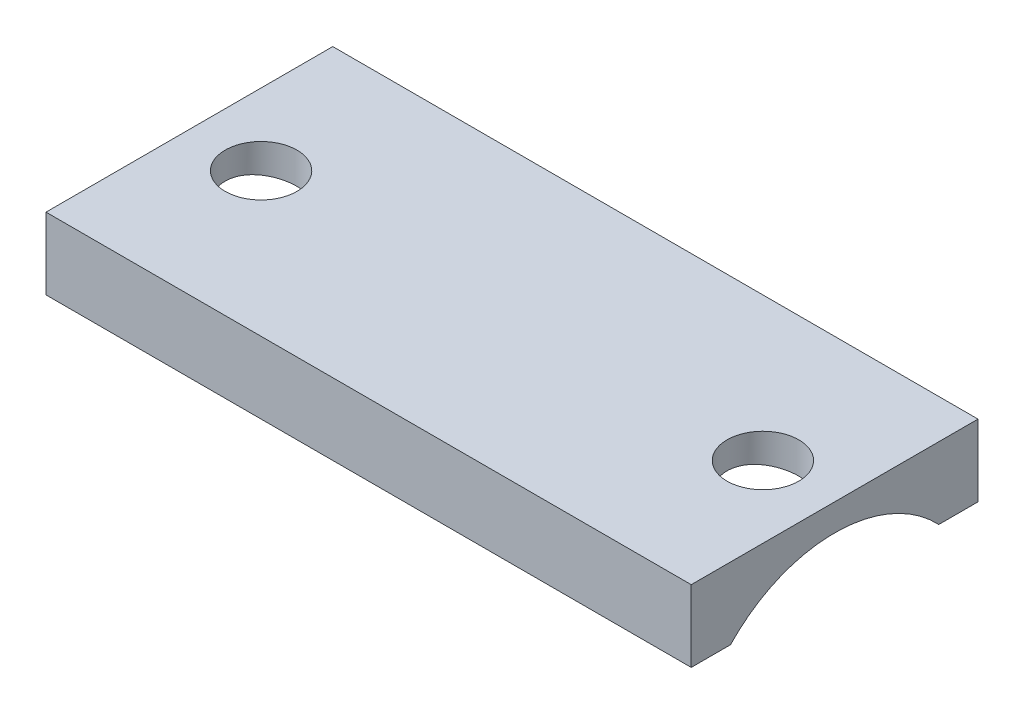
ISO-10303-21;
HEADER;
FILE_DESCRIPTION(('STEP AP214'),'2;1');
FILE_NAME('part.step','',(''),(''),'','','');
FILE_SCHEMA(('AUTOMOTIVE_DESIGN { 1 0 10303 214 1 1 1 1 }'));
ENDSEC;
DATA;
#1=APPLICATION_CONTEXT('core data for automotive mechanical design processes');
#2=APPLICATION_PROTOCOL_DEFINITION('international standard','automotive_design',2000,#1);
#3=PRODUCT_CONTEXT('',#1,'mechanical');
#4=PRODUCT('Part','Part','',(#3));
#5=PRODUCT_RELATED_PRODUCT_CATEGORY('part','',(#4));
#6=PRODUCT_DEFINITION_FORMATION('','',#4);
#7=PRODUCT_DEFINITION_CONTEXT('part definition',#1,'design');
#8=PRODUCT_DEFINITION('design','',#6,#7);
#9=PRODUCT_DEFINITION_SHAPE('','',#8);
#10=(LENGTH_UNIT() NAMED_UNIT(*) SI_UNIT(.MILLI.,.METRE.));
#11=(NAMED_UNIT(*) PLANE_ANGLE_UNIT() SI_UNIT($,.RADIAN.));
#12=(NAMED_UNIT(*) SI_UNIT($,.STERADIAN.) SOLID_ANGLE_UNIT());
#13=UNCERTAINTY_MEASURE_WITH_UNIT(LENGTH_MEASURE(1.E-05),#10,'distance_accuracy_value','');
#14=(GEOMETRIC_REPRESENTATION_CONTEXT(3) GLOBAL_UNCERTAINTY_ASSIGNED_CONTEXT((#13)) GLOBAL_UNIT_ASSIGNED_CONTEXT((#10,
#11,#12)) REPRESENTATION_CONTEXT('',''));
#15=CARTESIAN_POINT('',(0.,0.,0.));
#16=DIRECTION('',(0.,0.,1.));
#17=DIRECTION('',(1.,0.,0.));
#18=AXIS2_PLACEMENT_3D('',#15,#16,#17);
#19=CARTESIAN_POINT('',(0.,0.,0.));
#20=DIRECTION('',(0.,-1.,0.));
#21=DIRECTION('',(0.,0.,-1.));
#22=AXIS2_PLACEMENT_3D('',#19,#20,#21);
#23=PLANE('',#22);
#24=DIRECTION('',(1.,0.,0.));
#25=VECTOR('',#24,1.);
#26=CARTESIAN_POINT('',(-577.85,0.,-21.9225415931564));
#27=LINE('',#26,#25);
#28=CARTESIAN_POINT('',(-2.22044604925031E-13,0.,-21.9225415931564));
#29=VERTEX_POINT('',#28);
#30=CARTESIAN_POINT('',(57.15,0.,-21.9225415931564));
#31=VERTEX_POINT('',#30);
#32=EDGE_CURVE('E11',#29,#31,#27,.T.);
#33=ORIENTED_EDGE('',*,*,#32,.F.);
#34=DIRECTION('',(0.,0.,1.));
#35=VECTOR('',#34,1.);
#36=CARTESIAN_POINT('',(0.,0.,0.));
#37=LINE('',#36,#35);
#38=CARTESIAN_POINT('',(0.,0.,-25.4));
#39=VERTEX_POINT('',#38);
#40=EDGE_CURVE('E118',#39,#29,#37,.T.);
#41=ORIENTED_EDGE('',*,*,#40,.F.);
#42=DIRECTION('',(-1.,0.,0.));
#43=VECTOR('',#42,1.);
#44=CARTESIAN_POINT('',(0.,0.,-25.4));
#45=LINE('',#44,#43);
#46=CARTESIAN_POINT('',(57.15,0.,-25.4));
#47=VERTEX_POINT('',#46);
#48=EDGE_CURVE('E83',#47,#39,#45,.T.);
#49=ORIENTED_EDGE('',*,*,#48,.F.);
#50=DIRECTION('',(0.,0.,-1.));
#51=VECTOR('',#50,1.);
#52=CARTESIAN_POINT('',(57.15,0.,0.));
#53=LINE('',#52,#51);
#54=EDGE_CURVE('E110',#31,#47,#53,.T.);
#55=ORIENTED_EDGE('',*,*,#54,.F.);
#56=EDGE_LOOP('',(#33,#41,#49,#55));
#57=FACE_BOUND('',#56,.T.);
#58=ADVANCED_FACE('F33',(#57),#23,.T.);
#59=CARTESIAN_POINT('',(0.,6.35,0.));
#60=DIRECTION('',(1.,0.,0.));
#61=DIRECTION('',(0.,0.,-1.));
#62=AXIS2_PLACEMENT_3D('',#59,#60,#61);
#63=PLANE('',#62);
#64=ORIENTED_EDGE('',*,*,#40,.T.);
#65=CARTESIAN_POINT('',(0.,-8.73125,-12.7));
#66=DIRECTION('',(1.,0.,0.));
#67=DIRECTION('',(0.,0.,-1.));
#68=AXIS2_PLACEMENT_3D('',#65,#66,#67);
#69=CIRCLE('',#68,12.7);
#70=CARTESIAN_POINT('',(-2.22044604925031E-13,0.,-3.47745840684359));
#71=VERTEX_POINT('',#70);
#72=EDGE_CURVE('E101',#29,#71,#69,.T.);
#73=ORIENTED_EDGE('',*,*,#72,.T.);
#74=CARTESIAN_POINT('',(0.,0.,0.));
#75=VERTEX_POINT('',#74);
#76=EDGE_CURVE('E172',#71,#75,#37,.T.);
#77=ORIENTED_EDGE('',*,*,#76,.T.);
#78=DIRECTION('',(0.,-1.,0.));
#79=VECTOR('',#78,1.);
#80=CARTESIAN_POINT('',(0.,6.35,0.));
#81=LINE('',#80,#79);
#82=CARTESIAN_POINT('',(0.,6.35,0.));
#83=VERTEX_POINT('',#82);
#84=EDGE_CURVE('E130',#83,#75,#81,.T.);
#85=ORIENTED_EDGE('',*,*,#84,.F.);
#86=DIRECTION('',(0.,0.,1.));
#87=VECTOR('',#86,1.);
#88=CARTESIAN_POINT('',(0.,6.35,0.));
#89=LINE('',#88,#87);
#90=CARTESIAN_POINT('',(0.,6.35,-25.4));
#91=VERTEX_POINT('',#90);
#92=EDGE_CURVE('E123',#91,#83,#89,.T.);
#93=ORIENTED_EDGE('',*,*,#92,.F.);
#94=DIRECTION('',(0.,-1.,0.));
#95=VECTOR('',#94,1.);
#96=CARTESIAN_POINT('',(0.,6.35,-25.4));
#97=LINE('',#96,#95);
#98=EDGE_CURVE('E124',#91,#39,#97,.T.);
#99=ORIENTED_EDGE('',*,*,#98,.T.);
#100=EDGE_LOOP('',(#64,#73,#77,#85,#93,#99));
#101=FACE_BOUND('',#100,.T.);
#102=ADVANCED_FACE('F35',(#101),#63,.F.);
#103=CARTESIAN_POINT('',(0.,6.35,0.));
#104=DIRECTION('',(0.,0.,-1.));
#105=DIRECTION('',(-1.,0.,0.));
#106=AXIS2_PLACEMENT_3D('',#103,#104,#105);
#107=PLANE('',#106);
#108=DIRECTION('',(1.,0.,0.));
#109=VECTOR('',#108,1.);
#110=CARTESIAN_POINT('',(0.,0.,0.));
#111=LINE('',#110,#109);
#112=CARTESIAN_POINT('',(57.15,0.,0.));
#113=VERTEX_POINT('',#112);
#114=EDGE_CURVE('E116',#75,#113,#111,.T.);
#115=ORIENTED_EDGE('',*,*,#114,.T.);
#116=DIRECTION('',(0.,-1.,0.));
#117=VECTOR('',#116,1.);
#118=CARTESIAN_POINT('',(57.15,6.35,0.));
#119=LINE('',#118,#117);
#120=CARTESIAN_POINT('',(57.15,6.35,0.));
#121=VERTEX_POINT('',#120);
#122=EDGE_CURVE('E128',#121,#113,#119,.T.);
#123=ORIENTED_EDGE('',*,*,#122,.F.);
#124=DIRECTION('',(1.,0.,0.));
#125=VECTOR('',#124,1.);
#126=CARTESIAN_POINT('',(0.,6.35,0.));
#127=LINE('',#126,#125);
#128=EDGE_CURVE('E91',#83,#121,#127,.T.);
#129=ORIENTED_EDGE('',*,*,#128,.F.);
#130=ORIENTED_EDGE('',*,*,#84,.T.);
#131=EDGE_LOOP('',(#115,#123,#129,#130));
#132=FACE_BOUND('',#131,.T.);
#133=ADVANCED_FACE('F157',(#132),#107,.F.);
#134=CARTESIAN_POINT('',(57.15,6.35,0.));
#135=DIRECTION('',(-1.,0.,0.));
#136=DIRECTION('',(0.,0.,1.));
#137=AXIS2_PLACEMENT_3D('',#134,#135,#136);
#138=PLANE('',#137);
#139=CARTESIAN_POINT('',(57.15,0.,-3.47745840684359));
#140=VERTEX_POINT('',#139);
#141=EDGE_CURVE('E113',#113,#140,#53,.T.);
#142=ORIENTED_EDGE('',*,*,#141,.T.);
#143=CARTESIAN_POINT('',(57.15,-8.73125,-12.7));
#144=DIRECTION('',(1.,0.,0.));
#145=DIRECTION('',(0.,0.,-1.));
#146=AXIS2_PLACEMENT_3D('',#143,#144,#145);
#147=CIRCLE('',#146,12.7);
#148=EDGE_CURVE('E53',#31,#140,#147,.T.);
#149=ORIENTED_EDGE('',*,*,#148,.F.);
#150=ORIENTED_EDGE('',*,*,#54,.T.);
#151=DIRECTION('',(0.,-1.,0.));
#152=VECTOR('',#151,1.);
#153=CARTESIAN_POINT('',(57.15,6.35,-25.4));
#154=LINE('',#153,#152);
#155=CARTESIAN_POINT('',(57.15,6.35,-25.4));
#156=VERTEX_POINT('',#155);
#157=EDGE_CURVE('E126',#156,#47,#154,.T.);
#158=ORIENTED_EDGE('',*,*,#157,.F.);
#159=DIRECTION('',(0.,0.,-1.));
#160=VECTOR('',#159,1.);
#161=CARTESIAN_POINT('',(57.15,6.35,0.));
#162=LINE('',#161,#160);
#163=EDGE_CURVE('E179',#121,#156,#162,.T.);
#164=ORIENTED_EDGE('',*,*,#163,.F.);
#165=ORIENTED_EDGE('',*,*,#122,.T.);
#166=EDGE_LOOP('',(#142,#149,#150,#158,#164,#165));
#167=FACE_BOUND('',#166,.T.);
#168=ADVANCED_FACE('F108',(#167),#138,.F.);
#169=CARTESIAN_POINT('',(0.,6.35,-25.4));
#170=DIRECTION('',(0.,0.,1.));
#171=DIRECTION('',(1.,0.,0.));
#172=AXIS2_PLACEMENT_3D('',#169,#170,#171);
#173=PLANE('',#172);
#174=ORIENTED_EDGE('',*,*,#48,.T.);
#175=ORIENTED_EDGE('',*,*,#98,.F.);
#176=DIRECTION('',(-1.,0.,0.));
#177=VECTOR('',#176,1.);
#178=CARTESIAN_POINT('',(0.,6.35,-25.4));
#179=LINE('',#178,#177);
#180=EDGE_CURVE('E62',#156,#91,#179,.T.);
#181=ORIENTED_EDGE('',*,*,#180,.F.);
#182=ORIENTED_EDGE('',*,*,#157,.T.);
#183=EDGE_LOOP('',(#174,#175,#181,#182));
#184=FACE_BOUND('',#183,.T.);
#185=ADVANCED_FACE('F168',(#184),#173,.F.);
#186=CARTESIAN_POINT('',(0.,6.35,0.));
#187=DIRECTION('',(0.,-1.,0.));
#188=DIRECTION('',(0.,0.,-1.));
#189=AXIS2_PLACEMENT_3D('',#186,#187,#188);
#190=PLANE('',#189);
#191=CARTESIAN_POINT('',(50.8,6.35,-12.7));
#192=DIRECTION('',(0.,1.,0.));
#193=DIRECTION('',(0.,0.,1.));
#194=AXIS2_PLACEMENT_3D('',#191,#192,#193);
#195=CIRCLE('',#194,3.175);
#196=CARTESIAN_POINT('',(50.8,6.35,-9.525));
#197=VERTEX_POINT('',#196);
#198=EDGE_CURVE('E243',#197,#197,#195,.T.);
#199=ORIENTED_EDGE('',*,*,#198,.F.);
#200=EDGE_LOOP('',(#199));
#201=FACE_BOUND('',#200,.T.);
#202=CARTESIAN_POINT('',(6.35,6.35,-12.7));
#203=DIRECTION('',(0.,1.,0.));
#204=DIRECTION('',(0.,0.,1.));
#205=AXIS2_PLACEMENT_3D('',#202,#203,#204);
#206=CIRCLE('',#205,3.175);
#207=CARTESIAN_POINT('',(6.35,6.35,-9.525));
#208=VERTEX_POINT('',#207);
#209=EDGE_CURVE('E136',#208,#208,#206,.T.);
#210=ORIENTED_EDGE('',*,*,#209,.F.);
#211=EDGE_LOOP('',(#210));
#212=FACE_BOUND('',#211,.T.);
#213=ORIENTED_EDGE('',*,*,#92,.T.);
#214=ORIENTED_EDGE('',*,*,#128,.T.);
#215=ORIENTED_EDGE('',*,*,#163,.T.);
#216=ORIENTED_EDGE('',*,*,#180,.T.);
#217=EDGE_LOOP('',(#213,#214,#215,#216));
#218=FACE_BOUND('',#217,.T.);
#219=ADVANCED_FACE('F161',(#201,#212,#218),#190,.F.);
#220=DIRECTION('',(1.,0.,0.));
#221=VECTOR('',#220,1.);
#222=CARTESIAN_POINT('',(-577.85,0.,-3.47745840684359));
#223=LINE('',#222,#221);
#224=EDGE_CURVE('E46',#140,#71,#223,.F.);
#225=ORIENTED_EDGE('',*,*,#224,.F.);
#226=ORIENTED_EDGE('',*,*,#141,.F.);
#227=ORIENTED_EDGE('',*,*,#114,.F.);
#228=ORIENTED_EDGE('',*,*,#76,.F.);
#229=EDGE_LOOP('',(#225,#226,#227,#228));
#230=FACE_BOUND('',#229,.T.);
#231=ADVANCED_FACE('F153',(#230),#23,.T.);
#232=CARTESIAN_POINT('',(-577.85,-8.73125,-12.7));
#233=DIRECTION('',(1.,0.,0.));
#234=DIRECTION('',(0.,0.,-1.));
#235=AXIS2_PLACEMENT_3D('',#232,#233,#234);
#236=CYLINDRICAL_SURFACE('',#235,12.7);
#237=CARTESIAN_POINT('',(50.8,3.56547212420855,-9.525));
#238=CARTESIAN_POINT('',(50.9753244536767,3.56547547111582,-9.5250049801868));
#239=CARTESIAN_POINT('',(51.1507040213217,3.56926268638538,-9.53957166821799));
#240=CARTESIAN_POINT('',(51.4964268242804,3.58396364730556,-9.59736063066098));
#241=CARTESIAN_POINT('',(51.6667670681746,3.5948815404947,-9.64059958243753));
#242=CARTESIAN_POINT('',(51.9973604934977,3.62253180237111,-9.75424617646731));
#243=CARTESIAN_POINT('',(52.1576263873398,3.63925666216881,-9.8246187456248));
#244=CARTESIAN_POINT('',(52.4640947827256,3.67662703876523,-9.99042815059804));
#245=CARTESIAN_POINT('',(52.6102966868419,3.69727272200681,-10.0858660505279));
#246=CARTESIAN_POINT('',(52.887704289483,3.74066709771644,-10.3013402973139));
#247=CARTESIAN_POINT('',(53.0185548724446,3.76344938981253,-10.4218271526159));
#248=CARTESIAN_POINT('',(53.2584169708376,3.80825851904423,-10.6830087785922));
#249=CARTESIAN_POINT('',(53.3674264445396,3.83028528539313,-10.823705436391));
#250=CARTESIAN_POINT('',(53.5619648438917,3.8714732771114,-11.1237455946297));
#251=CARTESIAN_POINT('',(53.6471449129651,3.89059022998752,-11.2833218882322));
#252=CARTESIAN_POINT('',(53.7893382480744,3.92342131145999,-11.6150857559482));
#253=CARTESIAN_POINT('',(53.8463556699327,3.93713623714617,-11.7872714650442));
#254=CARTESIAN_POINT('',(53.9294677499148,3.95738043737189,-12.1356643763822));
#255=CARTESIAN_POINT('',(53.9561654482948,3.96404965182279,-12.3117194461728));
#256=CARTESIAN_POINT('',(53.9797731416799,3.96993864516269,-12.6659273995363));
#257=CARTESIAN_POINT('',(53.9766875407062,3.96915952542815,-12.8440799690633));
#258=CARTESIAN_POINT('',(53.9412499401823,3.96034380590988,-13.1932433847723));
#259=CARTESIAN_POINT('',(53.9095488671816,3.95246862972906,-13.3643249845334));
#260=CARTESIAN_POINT('',(53.8188264870384,3.93053362386568,-13.6986589355384));
#261=CARTESIAN_POINT('',(53.7598037255707,3.91647346496034,-13.8619108695011));
#262=CARTESIAN_POINT('',(53.6155867352274,3.88350137320123,-14.1776662836182));
#263=CARTESIAN_POINT('',(53.5301608532796,3.86454675012664,-14.3300593185086));
#264=CARTESIAN_POINT('',(53.3357382875223,3.82384177838309,-14.618575100931));
#265=CARTESIAN_POINT('',(53.226737502928,3.80209094358865,-14.7546950113965));
#266=CARTESIAN_POINT('',(52.9847698976824,3.75746916487082,-15.0106825613947));
#267=CARTESIAN_POINT('',(52.8512342867184,3.73458383797127,-15.1300106310637));
#268=CARTESIAN_POINT('',(52.5658080336039,3.69081105267005,-15.3446999936826));
#269=CARTESIAN_POINT('',(52.4139165340463,3.66992368767527,-15.4400601664461));
#270=CARTESIAN_POINT('',(52.095031656631,3.63246030973235,-15.6044523096467));
#271=CARTESIAN_POINT('',(51.9279686225027,3.61590569320599,-15.6733543751312));
#272=CARTESIAN_POINT('',(51.5841164555424,3.58925672988809,-15.7819268455205));
#273=CARTESIAN_POINT('',(51.4073294127396,3.57916100070271,-15.821603505806));
#274=CARTESIAN_POINT('',(51.054051433057,3.5668630212947,-15.8697036411057));
#275=CARTESIAN_POINT('',(50.8776760024569,3.56445933000706,-15.8789249018773));
#276=CARTESIAN_POINT('',(50.5259061405367,3.56726926073159,-15.8680365779543));
#277=CARTESIAN_POINT('',(50.3505116204042,3.57248218154281,-15.8479296932693));
#278=CARTESIAN_POINT('',(50.0086448835153,3.58974494120924,-15.7796553392016));
#279=CARTESIAN_POINT('',(49.8420736372571,3.60168152208015,-15.731952366718));
#280=CARTESIAN_POINT('',(49.5192920485263,3.63093912193762,-15.6103549637215));
#281=CARTESIAN_POINT('',(49.3630829359992,3.64826077872938,-15.5364574305949));
#282=CARTESIAN_POINT('',(49.0620795771091,3.686760941113,-15.3628987482795));
#283=CARTESIAN_POINT('',(48.9175693731454,3.70800844131201,-15.2627606273713));
#284=CARTESIAN_POINT('',(48.6471107792421,3.75179695500313,-15.0401664300669));
#285=CARTESIAN_POINT('',(48.5211654458544,3.7743381806495,-14.9177066860073));
#286=CARTESIAN_POINT('',(48.2881799759349,3.81885701850353,-14.6502841391265));
#287=CARTESIAN_POINT('',(48.181691720563,3.84080641618588,-14.5048349492878));
#288=CARTESIAN_POINT('',(47.9946514489719,3.88108465099386,-14.1976560175556));
#289=CARTESIAN_POINT('',(47.9140980799076,3.89941367695015,-14.0359271254404));
#290=CARTESIAN_POINT('',(47.7819135361495,3.93027046987672,-13.7018972904962));
#291=CARTESIAN_POINT('',(47.7300743588386,3.9428398412846,-13.5296826847635));
#292=CARTESIAN_POINT('',(47.6561653750473,3.96094322612652,-13.1786304890122));
#293=CARTESIAN_POINT('',(47.6340898234014,3.96647859729646,-12.9997941840059));
#294=CARTESIAN_POINT('',(47.6206579030977,3.9698348787296,-12.6457598035425));
#295=CARTESIAN_POINT('',(47.6284870736221,3.96786032943964,-12.4705940993829));
#296=CARTESIAN_POINT('',(47.6727768516596,3.95687221252383,-12.1241581988832));
#297=CARTESIAN_POINT('',(47.7092366076668,3.94785885424011,-11.9528878868456));
#298=CARTESIAN_POINT('',(47.8093157977725,3.92383749311098,-11.6199569618279));
#299=CARTESIAN_POINT('',(47.8727879642732,3.90886202295096,-11.4582495797058));
#300=CARTESIAN_POINT('',(48.0249565883871,3.87449342300864,-11.1476883565929));
#301=CARTESIAN_POINT('',(48.1136562257288,3.85509973640556,-10.9988361389816));
#302=CARTESIAN_POINT('',(48.3162458679377,3.81340517734912,-10.714348877256));
#303=CARTESIAN_POINT('',(48.4306884537197,3.79104578789785,-10.5791159121528));
#304=CARTESIAN_POINT('',(48.6804425550281,3.74620310756578,-10.3294973106316));
#305=CARTESIAN_POINT('',(48.8157593536529,3.72371978671185,-10.2151169678818));
#306=CARTESIAN_POINT('',(49.1064594900515,3.6806973580947,-10.0083555659519));
#307=CARTESIAN_POINT('',(49.2621700916847,3.66020234662692,-9.91642473335301));
#308=CARTESIAN_POINT('',(49.5873261803525,3.62407058696079,-9.76018210334114));
#309=CARTESIAN_POINT('',(49.756761567348,3.60843030640454,-9.69585021153692));
#310=CARTESIAN_POINT('',(50.0715820125766,3.58622310283591,-9.60620847178707));
#311=CARTESIAN_POINT('',(50.215460796926,3.57850005036109,-9.57582168335491));
#312=CARTESIAN_POINT('',(50.5062136590677,3.56812337499819,-9.53521622108463));
#313=CARTESIAN_POINT('',(50.653087480276,3.56546931967917,-9.5249958268697));
#314=CARTESIAN_POINT('',(50.8,3.56547212420855,-9.525));
#315=B_SPLINE_CURVE_WITH_KNOTS('',3,(#237,#238,#239,#240,#241,#242,#243,#244,#245,#246,#247,
#248,#249,#250,#251,#252,#253,#254,#255,#256,#257,#258,#259,#260,#261,#262,#263,#264,#265,#266,
#267,#268,#269,#270,#271,#272,#273,#274,#275,#276,#277,#278,#279,#280,#281,#282,#283,#284,#285,
#286,#287,#288,#289,#290,#291,#292,#293,#294,#295,#296,#297,#298,#299,#300,#301,#302,#303,#304,
#305,#306,#307,#308,#309,#310,#311,#312,#313,#314),.UNSPECIFIED.,.T.,.F.,(4,2,2,2,2,2,2,2,2,2,2,
2,2,2,2,2,2,2,2,2,2,2,2,2,2,2,2,2,2,2,2,2,2,2,2,2,2,2,4),(0.,0.525433851004893,1.0511735916144,
1.57623602350084,2.10132074979457,2.6368242182508,3.1723777227943,3.71540400425357,
4.25835013005805,4.79029713764088,5.32216548805845,5.84223193614961,6.36232607040477,
6.88711950303144,7.41200429545519,7.95109492546326,8.49021074623747,9.03194068650669,
9.57355464164524,10.1008633995054,10.6281236152971,11.1467570436797,11.6654519221148,
12.1943221424741,12.7232793399029,13.2654717033223,13.8076357797011,14.3458193247108,
14.8838989712076,15.4074297658815,15.9309449907504,16.4516419323711,16.9724045329363,
17.5056431266551,18.0390169009447,18.5823412615974,19.1252693614627,19.5655924052587,
20.0058778838705),.UNSPECIFIED.);
#316=CARTESIAN_POINT('',(50.8,3.56547212420855,-9.525));
#317=VERTEX_POINT('',#316);
#318=EDGE_CURVE('E37',#317,#317,#315,.T.);
#319=ORIENTED_EDGE('',*,*,#318,.T.);
#320=EDGE_LOOP('',(#319));
#321=FACE_BOUND('',#320,.T.);
#322=CARTESIAN_POINT('',(6.35,3.56547212420855,-9.525));
#323=CARTESIAN_POINT('',(6.52532445367675,3.56547547111582,-9.5250049801868));
#324=CARTESIAN_POINT('',(6.70070402132172,3.56926268638538,-9.53957166821798));
#325=CARTESIAN_POINT('',(7.04642682428036,3.58396364730556,-9.59736063066098));
#326=CARTESIAN_POINT('',(7.21676706817459,3.5948815404947,-9.64059958243753));
#327=CARTESIAN_POINT('',(7.54736049349772,3.62253180237111,-9.7542461764673));
#328=CARTESIAN_POINT('',(7.70762638733985,3.63925666216881,-9.82461874562479));
#329=CARTESIAN_POINT('',(8.01409478272565,3.67662703876523,-9.99042815059804));
#330=CARTESIAN_POINT('',(8.16029668684187,3.69727272200681,-10.0858660505279));
#331=CARTESIAN_POINT('',(8.43770428948301,3.74066709771643,-10.3013402973139));
#332=CARTESIAN_POINT('',(8.56855487244456,3.76344938981253,-10.4218271526159));
#333=CARTESIAN_POINT('',(8.80841697083763,3.80825851904423,-10.6830087785921));
#334=CARTESIAN_POINT('',(8.91742644453961,3.83028528539313,-10.823705436391));
#335=CARTESIAN_POINT('',(9.11196484389172,3.8714732771114,-11.1237455946297));
#336=CARTESIAN_POINT('',(9.19714491296506,3.89059022998752,-11.2833218882322));
#337=CARTESIAN_POINT('',(9.33933824807441,3.92342131145999,-11.6150857559482));
#338=CARTESIAN_POINT('',(9.3963556699327,3.93713623714617,-11.7872714650442));
#339=CARTESIAN_POINT('',(9.4794677499148,3.95738043737189,-12.1356643763822));
#340=CARTESIAN_POINT('',(9.50616544829476,3.96404965182279,-12.3117194461728));
#341=CARTESIAN_POINT('',(9.52977314167996,3.96993864516268,-12.6659273995363));
#342=CARTESIAN_POINT('',(9.5266875407062,3.96915952542815,-12.8440799690633));
#343=CARTESIAN_POINT('',(9.49124994018232,3.96034380590988,-13.1932433847723));
#344=CARTESIAN_POINT('',(9.45954886718161,3.95246862972906,-13.3643249845334));
#345=CARTESIAN_POINT('',(9.36882648703841,3.93053362386568,-13.6986589355384));
#346=CARTESIAN_POINT('',(9.3098037255707,3.91647346496034,-13.8619108695011));
#347=CARTESIAN_POINT('',(9.16558673522744,3.88350137320123,-14.1776662836182));
#348=CARTESIAN_POINT('',(9.08016085327959,3.86454675012664,-14.3300593185086));
#349=CARTESIAN_POINT('',(8.88573828752236,3.82384177838309,-14.618575100931));
#350=CARTESIAN_POINT('',(8.77673750292801,3.80209094358865,-14.7546950113965));
#351=CARTESIAN_POINT('',(8.5347698976824,3.75746916487082,-15.0106825613947));
#352=CARTESIAN_POINT('',(8.40123428671837,3.73458383797127,-15.1300106310637));
#353=CARTESIAN_POINT('',(8.11580803360385,3.69081105267005,-15.3446999936826));
#354=CARTESIAN_POINT('',(7.96391653404631,3.66992368767527,-15.4400601664461));
#355=CARTESIAN_POINT('',(7.64503165663096,3.63246030973235,-15.6044523096467));
#356=CARTESIAN_POINT('',(7.47796862250275,3.61590569320599,-15.6733543751312));
#357=CARTESIAN_POINT('',(7.13411645554242,3.58925672988809,-15.7819268455205));
#358=CARTESIAN_POINT('',(6.95732941273958,3.57916100070271,-15.821603505806));
#359=CARTESIAN_POINT('',(6.60405143305702,3.5668630212947,-15.8697036411057));
#360=CARTESIAN_POINT('',(6.42767600245691,3.56445933000706,-15.8789249018773));
#361=CARTESIAN_POINT('',(6.07590614053674,3.56726926073159,-15.8680365779543));
#362=CARTESIAN_POINT('',(5.90051162040423,3.57248218154281,-15.8479296932693));
#363=CARTESIAN_POINT('',(5.55864488351533,3.58974494120924,-15.7796553392016));
#364=CARTESIAN_POINT('',(5.39207363725713,3.60168152208015,-15.731952366718));
#365=CARTESIAN_POINT('',(5.06929204852629,3.63093912193762,-15.6103549637215));
#366=CARTESIAN_POINT('',(4.91308293599917,3.64826077872938,-15.5364574305949));
#367=CARTESIAN_POINT('',(4.61207957710906,3.68676094111299,-15.3628987482795));
#368=CARTESIAN_POINT('',(4.46756937314543,3.70800844131201,-15.2627606273713));
#369=CARTESIAN_POINT('',(4.19711077924214,3.75179695500313,-15.0401664300669));
#370=CARTESIAN_POINT('',(4.07116544585437,3.77433818064949,-14.9177066860073));
#371=CARTESIAN_POINT('',(3.83817997593493,3.81885701850352,-14.6502841391265));
#372=CARTESIAN_POINT('',(3.73169172056303,3.84080641618588,-14.5048349492878));
#373=CARTESIAN_POINT('',(3.54465144897191,3.88108465099386,-14.1976560175556));
#374=CARTESIAN_POINT('',(3.46409807990758,3.89941367695015,-14.0359271254404));
#375=CARTESIAN_POINT('',(3.33191353614953,3.93027046987672,-13.7018972904962));
#376=CARTESIAN_POINT('',(3.28007435883859,3.9428398412846,-13.5296826847635));
#377=CARTESIAN_POINT('',(3.20616537504732,3.96094322612652,-13.1786304890122));
#378=CARTESIAN_POINT('',(3.18408982340142,3.96647859729646,-12.9997941840059));
#379=CARTESIAN_POINT('',(3.17065790309766,3.96983487872959,-12.6457598035425));
#380=CARTESIAN_POINT('',(3.17848707362208,3.96786032943963,-12.4705940993829));
#381=CARTESIAN_POINT('',(3.22277685165956,3.95687221252382,-12.1241581988832));
#382=CARTESIAN_POINT('',(3.25923660766681,3.94785885424011,-11.9528878868456));
#383=CARTESIAN_POINT('',(3.35931579777248,3.92383749311098,-11.6199569618279));
#384=CARTESIAN_POINT('',(3.42278796427315,3.90886202295096,-11.4582495797058));
#385=CARTESIAN_POINT('',(3.57495658838714,3.87449342300864,-11.1476883565929));
#386=CARTESIAN_POINT('',(3.66365622572878,3.85509973640556,-10.9988361389816));
#387=CARTESIAN_POINT('',(3.86624586793771,3.81340517734912,-10.714348877256));
#388=CARTESIAN_POINT('',(3.98068845371965,3.79104578789785,-10.5791159121528));
#389=CARTESIAN_POINT('',(4.23044255502807,3.74620310756577,-10.3294973106316));
#390=CARTESIAN_POINT('',(4.36575935365293,3.72371978671185,-10.2151169678818));
#391=CARTESIAN_POINT('',(4.65645949005152,3.6806973580947,-10.0083555659519));
#392=CARTESIAN_POINT('',(4.81217009168467,3.66020234662692,-9.916424733353));
#393=CARTESIAN_POINT('',(5.13732618035254,3.62407058696079,-9.76018210334114));
#394=CARTESIAN_POINT('',(5.30676156734795,3.60843030640454,-9.69585021153692));
#395=CARTESIAN_POINT('',(5.62158201257663,3.58622310283591,-9.60620847178707));
#396=CARTESIAN_POINT('',(5.76546079692598,3.57850005036109,-9.57582168335491));
#397=CARTESIAN_POINT('',(6.05621365906766,3.56812337499819,-9.53521622108463));
#398=CARTESIAN_POINT('',(6.20308748027598,3.56546931967917,-9.52499582686969));
#399=CARTESIAN_POINT('',(6.35,3.56547212420855,-9.525));
#400=B_SPLINE_CURVE_WITH_KNOTS('',3,(#322,#323,#324,#325,#326,#327,#328,#329,#330,#331,#332,
#333,#334,#335,#336,#337,#338,#339,#340,#341,#342,#343,#344,#345,#346,#347,#348,#349,#350,#351,
#352,#353,#354,#355,#356,#357,#358,#359,#360,#361,#362,#363,#364,#365,#366,#367,#368,#369,#370,
#371,#372,#373,#374,#375,#376,#377,#378,#379,#380,#381,#382,#383,#384,#385,#386,#387,#388,#389,
#390,#391,#392,#393,#394,#395,#396,#397,#398,#399),.UNSPECIFIED.,.T.,.F.,(4,2,2,2,2,2,2,2,2,2,2,
2,2,2,2,2,2,2,2,2,2,2,2,2,2,2,2,2,2,2,2,2,2,2,2,2,2,2,4),(0.,0.525433851004891,1.0511735916144,
1.57623602350084,2.10132074979457,2.63682421825079,3.1723777227943,3.71540400425357,
4.25835013005806,4.79029713764089,5.32216548805845,5.84223193614962,6.36232607040478,
6.88711950303144,7.4120042954552,7.95109492546327,8.49021074623748,9.0319406865067,
9.57355464164525,10.1008633995054,10.6281236152971,11.1467570436797,11.6654519221148,
12.1943221424741,12.7232793399029,13.2654717033223,13.8076357797011,14.3458193247108,
14.8838989712076,15.4074297658815,15.9309449907505,16.4516419323711,16.9724045329363,
17.5056431266551,18.0390169009448,18.5823412615974,19.1252693614627,19.5655924052587,
20.0058778838705),.UNSPECIFIED.);
#401=CARTESIAN_POINT('',(6.35,3.56547212420855,-9.525));
#402=VERTEX_POINT('',#401);
#403=EDGE_CURVE('E114',#402,#402,#400,.T.);
#404=ORIENTED_EDGE('',*,*,#403,.T.);
#405=EDGE_LOOP('',(#404));
#406=FACE_BOUND('',#405,.T.);
#407=ORIENTED_EDGE('',*,*,#32,.T.);
#408=ORIENTED_EDGE('',*,*,#148,.T.);
#409=ORIENTED_EDGE('',*,*,#224,.T.);
#410=ORIENTED_EDGE('',*,*,#72,.F.);
#411=EDGE_LOOP('',(#407,#408,#409,#410));
#412=FACE_BOUND('',#411,.T.);
#413=ADVANCED_FACE('F99',(#321,#406,#412),#236,.F.);
#414=CARTESIAN_POINT('',(6.35,0.,-12.7));
#415=DIRECTION('',(0.,1.,0.));
#416=DIRECTION('',(0.,0.,1.));
#417=AXIS2_PLACEMENT_3D('',#414,#415,#416);
#418=CYLINDRICAL_SURFACE('',#417,3.175);
#419=ORIENTED_EDGE('',*,*,#209,.T.);
#420=EDGE_LOOP('',(#419));
#421=FACE_BOUND('',#420,.T.);
#422=ORIENTED_EDGE('',*,*,#403,.F.);
#423=EDGE_LOOP('',(#422));
#424=FACE_BOUND('',#423,.T.);
#425=ADVANCED_FACE('F139',(#421,#424),#418,.F.);
#426=CARTESIAN_POINT('',(50.8,0.,-12.7));
#427=DIRECTION('',(0.,1.,0.));
#428=DIRECTION('',(0.,0.,1.));
#429=AXIS2_PLACEMENT_3D('',#426,#427,#428);
#430=CYLINDRICAL_SURFACE('',#429,3.175);
#431=ORIENTED_EDGE('',*,*,#198,.T.);
#432=EDGE_LOOP('',(#431));
#433=FACE_BOUND('',#432,.T.);
#434=ORIENTED_EDGE('',*,*,#318,.F.);
#435=EDGE_LOOP('',(#434));
#436=FACE_BOUND('',#435,.T.);
#437=ADVANCED_FACE('F142',(#433,#436),#430,.F.);
#438=CLOSED_SHELL('',(#58,#102,#133,#168,#185,#219,#231,#413,#425,#437));
#439=MANIFOLD_SOLID_BREP('B2',#438);
#440=ADVANCED_BREP_SHAPE_REPRESENTATION('',(#18,#439),#14);
#441=SHAPE_DEFINITION_REPRESENTATION(#9,#440);
ENDSEC;
END-ISO-10303-21;
